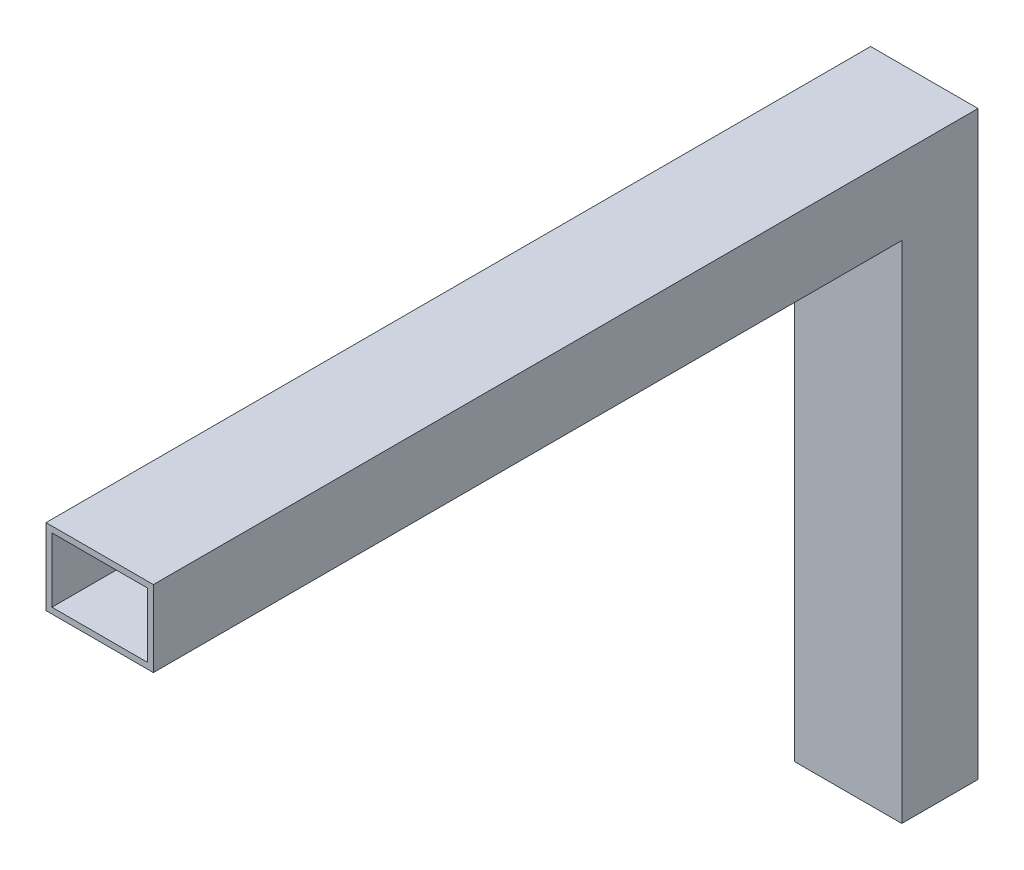
ISO-10303-21;
HEADER;
FILE_DESCRIPTION(('STEP AP214'),'2;1');
FILE_NAME('part.step','',(''),(''),'','','');
FILE_SCHEMA(('AUTOMOTIVE_DESIGN { 1 0 10303 214 1 1 1 1 }'));
ENDSEC;
DATA;
#1=APPLICATION_CONTEXT('core data for automotive mechanical design processes');
#2=APPLICATION_PROTOCOL_DEFINITION('international standard','automotive_design',2000,#1);
#3=PRODUCT_CONTEXT('',#1,'mechanical');
#4=PRODUCT('Part','Part','',(#3));
#5=PRODUCT_RELATED_PRODUCT_CATEGORY('part','',(#4));
#6=PRODUCT_DEFINITION_FORMATION('','',#4);
#7=PRODUCT_DEFINITION_CONTEXT('part definition',#1,'design');
#8=PRODUCT_DEFINITION('design','',#6,#7);
#9=PRODUCT_DEFINITION_SHAPE('','',#8);
#10=(LENGTH_UNIT() NAMED_UNIT(*) SI_UNIT(.MILLI.,.METRE.));
#11=(NAMED_UNIT(*) PLANE_ANGLE_UNIT() SI_UNIT($,.RADIAN.));
#12=(NAMED_UNIT(*) SI_UNIT($,.STERADIAN.) SOLID_ANGLE_UNIT());
#13=UNCERTAINTY_MEASURE_WITH_UNIT(LENGTH_MEASURE(1.E-05),#10,'distance_accuracy_value','');
#14=(GEOMETRIC_REPRESENTATION_CONTEXT(3) GLOBAL_UNCERTAINTY_ASSIGNED_CONTEXT((#13)) GLOBAL_UNIT_ASSIGNED_CONTEXT((#10,
#11,#12)) REPRESENTATION_CONTEXT('',''));
#15=CARTESIAN_POINT('',(0.,0.,0.));
#16=DIRECTION('',(0.,0.,1.));
#17=DIRECTION('',(1.,0.,0.));
#18=AXIS2_PLACEMENT_3D('',#15,#16,#17);
#19=CARTESIAN_POINT('',(0.,-24.8230901340624,14.5610305255673));
#20=DIRECTION('',(0.,1.,0.));
#21=DIRECTION('',(1.,0.,0.));
#22=AXIS2_PLACEMENT_3D('',#19,#20,#21);
#23=PLANE('',#22);
#24=DIRECTION('',(0.,0.,1.));
#25=VECTOR('',#24,1.);
#26=CARTESIAN_POINT('',(4.52520100822085,-24.8230901340624,-9.59201427052958));
#27=LINE('',#26,#25);
#28=CARTESIAN_POINT('',(4.52520100822085,-24.8230901340624,-9.59201427052958));
#29=VERTEX_POINT('',#28);
#30=CARTESIAN_POINT('',(4.52520100822085,-24.8230901340624,-3.16622199949135));
#31=VERTEX_POINT('',#30);
#32=EDGE_CURVE('E208',#29,#31,#27,.T.);
#33=ORIENTED_EDGE('',*,*,#32,.T.);
#34=DIRECTION('',(-1.,0.,0.));
#35=VECTOR('',#34,1.);
#36=CARTESIAN_POINT('',(-4.52520100822085,-24.8230901340624,-3.16622199949135));
#37=LINE('',#36,#35);
#38=CARTESIAN_POINT('',(-4.52520100822085,-24.8230901340624,-3.16622199949135));
#39=VERTEX_POINT('',#38);
#40=EDGE_CURVE('E206',#31,#39,#37,.T.);
#41=ORIENTED_EDGE('',*,*,#40,.T.);
#42=DIRECTION('',(0.,0.,-1.));
#43=VECTOR('',#42,1.);
#44=CARTESIAN_POINT('',(-4.52520100822085,-24.8230901340624,-9.59201427052958));
#45=LINE('',#44,#43);
#46=CARTESIAN_POINT('',(-4.52520100822085,-24.8230901340624,-9.59201427052958));
#47=VERTEX_POINT('',#46);
#48=EDGE_CURVE('E204',#39,#47,#45,.T.);
#49=ORIENTED_EDGE('',*,*,#48,.T.);
#50=DIRECTION('',(1.,0.,0.));
#51=VECTOR('',#50,1.);
#52=CARTESIAN_POINT('',(-4.52520100822085,-24.8230901340624,-9.59201427052958));
#53=LINE('',#52,#51);
#54=EDGE_CURVE('E147',#47,#29,#53,.T.);
#55=ORIENTED_EDGE('',*,*,#54,.T.);
#56=EDGE_LOOP('',(#33,#41,#49,#55));
#57=FACE_BOUND('',#56,.T.);
#58=DIRECTION('',(0.,0.,1.));
#59=VECTOR('',#58,1.);
#60=CARTESIAN_POINT('',(4.02520100822085,-24.8230901340624,-9.59201427052958));
#61=LINE('',#60,#59);
#62=CARTESIAN_POINT('',(4.02520100822085,-24.8230901340624,-9.09201427052958));
#63=VERTEX_POINT('',#62);
#64=CARTESIAN_POINT('',(4.02520100822085,-24.8230901340624,-3.66622199949135));
#65=VERTEX_POINT('',#64);
#66=EDGE_CURVE('E137',#63,#65,#61,.T.);
#67=ORIENTED_EDGE('',*,*,#66,.F.);
#68=DIRECTION('',(1.,0.,0.));
#69=VECTOR('',#68,1.);
#70=CARTESIAN_POINT('',(-4.52520100822085,-24.8230901340624,-9.09201427052958));
#71=LINE('',#70,#69);
#72=CARTESIAN_POINT('',(-4.02520100822085,-24.8230901340624,-9.09201427052958));
#73=VERTEX_POINT('',#72);
#74=EDGE_CURVE('E167',#73,#63,#71,.T.);
#75=ORIENTED_EDGE('',*,*,#74,.F.);
#76=DIRECTION('',(0.,0.,-1.));
#77=VECTOR('',#76,1.);
#78=CARTESIAN_POINT('',(-4.02520100822085,-24.8230901340624,-9.59201427052958));
#79=LINE('',#78,#77);
#80=CARTESIAN_POINT('',(-4.02520100822085,-24.8230901340624,-3.66622199949135));
#81=VERTEX_POINT('',#80);
#82=EDGE_CURVE('E165',#81,#73,#79,.T.);
#83=ORIENTED_EDGE('',*,*,#82,.F.);
#84=DIRECTION('',(-1.,0.,0.));
#85=VECTOR('',#84,1.);
#86=CARTESIAN_POINT('',(-4.52520100822085,-24.8230901340624,-3.66622199949135));
#87=LINE('',#86,#85);
#88=EDGE_CURVE('E163',#65,#81,#87,.T.);
#89=ORIENTED_EDGE('',*,*,#88,.F.);
#90=EDGE_LOOP('',(#67,#75,#83,#89));
#91=FACE_BOUND('',#90,.T.);
#92=ADVANCED_FACE('F39',(#57,#91),#23,.F.);
#93=CARTESIAN_POINT('',(0.,0.,59.90823987662));
#94=DIRECTION('',(0.,0.,1.));
#95=DIRECTION('',(1.,0.,0.));
#96=AXIS2_PLACEMENT_3D('',#93,#94,#95);
#97=PLANE('',#96);
#98=DIRECTION('',(0.,-1.,0.));
#99=VECTOR('',#98,1.);
#100=CARTESIAN_POINT('',(4.52520100822085,24.1530447960969,59.90823987662));
#101=LINE('',#100,#99);
#102=CARTESIAN_POINT('',(4.52520100822085,24.1530447960969,59.90823987662));
#103=VERTEX_POINT('',#102);
#104=CARTESIAN_POINT('',(4.52520100822085,17.7272525250587,59.90823987662));
#105=VERTEX_POINT('',#104);
#106=EDGE_CURVE('E180',#103,#105,#101,.T.);
#107=ORIENTED_EDGE('',*,*,#106,.F.);
#108=DIRECTION('',(1.,0.,0.));
#109=VECTOR('',#108,1.);
#110=CARTESIAN_POINT('',(-4.52520100822085,24.1530447960969,59.90823987662));
#111=LINE('',#110,#109);
#112=CARTESIAN_POINT('',(-4.52520100822085,24.1530447960969,59.90823987662));
#113=VERTEX_POINT('',#112);
#114=EDGE_CURVE('E191',#113,#103,#111,.T.);
#115=ORIENTED_EDGE('',*,*,#114,.F.);
#116=DIRECTION('',(0.,1.,0.));
#117=VECTOR('',#116,1.);
#118=CARTESIAN_POINT('',(-4.52520100822085,24.1530447960969,59.90823987662));
#119=LINE('',#118,#117);
#120=CARTESIAN_POINT('',(-4.52520100822085,17.7272525250587,59.90823987662));
#121=VERTEX_POINT('',#120);
#122=EDGE_CURVE('E194',#121,#113,#119,.T.);
#123=ORIENTED_EDGE('',*,*,#122,.F.);
#124=DIRECTION('',(-1.,0.,0.));
#125=VECTOR('',#124,1.);
#126=CARTESIAN_POINT('',(-4.52520100822085,17.7272525250587,59.90823987662));
#127=LINE('',#126,#125);
#128=EDGE_CURVE('E183',#105,#121,#127,.T.);
#129=ORIENTED_EDGE('',*,*,#128,.F.);
#130=EDGE_LOOP('',(#107,#115,#123,#129));
#131=FACE_BOUND('',#130,.T.);
#132=DIRECTION('',(1.,0.,0.));
#133=VECTOR('',#132,1.);
#134=CARTESIAN_POINT('',(-4.52520100822085,23.6530447960969,59.90823987662));
#135=LINE('',#134,#133);
#136=CARTESIAN_POINT('',(-4.02520100822085,23.6530447960969,59.90823987662));
#137=VERTEX_POINT('',#136);
#138=CARTESIAN_POINT('',(4.02520100822085,23.6530447960969,59.90823987662));
#139=VERTEX_POINT('',#138);
#140=EDGE_CURVE('E158',#137,#139,#135,.T.);
#141=ORIENTED_EDGE('',*,*,#140,.T.);
#142=DIRECTION('',(0.,-1.,0.));
#143=VECTOR('',#142,1.);
#144=CARTESIAN_POINT('',(4.02520100822085,24.1530447960969,59.90823987662));
#145=LINE('',#144,#143);
#146=CARTESIAN_POINT('',(4.02520100822085,18.2272525250587,59.90823987662));
#147=VERTEX_POINT('',#146);
#148=EDGE_CURVE('E175',#139,#147,#145,.T.);
#149=ORIENTED_EDGE('',*,*,#148,.T.);
#150=DIRECTION('',(-1.,0.,0.));
#151=VECTOR('',#150,1.);
#152=CARTESIAN_POINT('',(-4.52520100822085,18.2272525250587,59.90823987662));
#153=LINE('',#152,#151);
#154=CARTESIAN_POINT('',(-4.02520100822085,18.2272525250587,59.90823987662));
#155=VERTEX_POINT('',#154);
#156=EDGE_CURVE('E152',#147,#155,#153,.T.);
#157=ORIENTED_EDGE('',*,*,#156,.T.);
#158=DIRECTION('',(0.,1.,0.));
#159=VECTOR('',#158,1.);
#160=CARTESIAN_POINT('',(-4.02520100822085,24.1530447960969,59.90823987662));
#161=LINE('',#160,#159);
#162=EDGE_CURVE('E171',#155,#137,#161,.T.);
#163=ORIENTED_EDGE('',*,*,#162,.T.);
#164=EDGE_LOOP('',(#141,#149,#157,#163));
#165=FACE_BOUND('',#164,.T.);
#166=ADVANCED_FACE('F230',(#131,#165),#97,.T.);
#167=CARTESIAN_POINT('',(-4.52520100822085,24.5743344096488,-3.16622199949135));
#168=DIRECTION('',(0.,0.,1.));
#169=DIRECTION('',(1.,0.,0.));
#170=AXIS2_PLACEMENT_3D('',#167,#168,#169);
#171=PLANE('',#170);
#172=DIRECTION('',(1.,0.,0.));
#173=VECTOR('',#172,1.);
#174=CARTESIAN_POINT('',(-4.52520100822085,17.7272525250587,-3.16622199949135));
#175=LINE('',#174,#173);
#176=CARTESIAN_POINT('',(-4.52520100822085,17.7272525250587,-3.16622199949135));
#177=VERTEX_POINT('',#176);
#178=CARTESIAN_POINT('',(4.52520100822085,17.7272525250587,-3.16622199949134));
#179=VERTEX_POINT('',#178);
#180=EDGE_CURVE('E11',#177,#179,#175,.T.);
#181=ORIENTED_EDGE('',*,*,#180,.F.);
#182=DIRECTION('',(0.,-1.,0.));
#183=VECTOR('',#182,1.);
#184=CARTESIAN_POINT('',(-4.52520100822085,24.5743344096488,-3.16622199949135));
#185=LINE('',#184,#183);
#186=EDGE_CURVE('E213',#177,#39,#185,.T.);
#187=ORIENTED_EDGE('',*,*,#186,.T.);
#188=ORIENTED_EDGE('',*,*,#40,.F.);
#189=DIRECTION('',(0.,-1.,0.));
#190=VECTOR('',#189,1.);
#191=CARTESIAN_POINT('',(4.52520100822085,24.5743344096488,-3.16622199949135));
#192=LINE('',#191,#190);
#193=EDGE_CURVE('E215',#179,#31,#192,.T.);
#194=ORIENTED_EDGE('',*,*,#193,.F.);
#195=EDGE_LOOP('',(#181,#187,#188,#194));
#196=FACE_BOUND('',#195,.T.);
#197=ADVANCED_FACE('F241',(#196),#171,.T.);
#198=CARTESIAN_POINT('',(-4.52520100822085,24.5743344096488,-9.59201427052958));
#199=DIRECTION('',(0.,0.,-1.));
#200=DIRECTION('',(-1.,0.,0.));
#201=AXIS2_PLACEMENT_3D('',#198,#199,#200);
#202=PLANE('',#201);
#203=DIRECTION('',(-1.,0.,0.));
#204=VECTOR('',#203,1.);
#205=CARTESIAN_POINT('',(-4.52520100822085,24.1530447960969,-9.59201427052958));
#206=LINE('',#205,#204);
#207=CARTESIAN_POINT('',(4.52520100822085,24.1530447960969,-9.59201427052958));
#208=VERTEX_POINT('',#207);
#209=CARTESIAN_POINT('',(-4.52520100822085,24.1530447960969,-9.59201427052958));
#210=VERTEX_POINT('',#209);
#211=EDGE_CURVE('E47',#208,#210,#206,.T.);
#212=ORIENTED_EDGE('',*,*,#211,.F.);
#213=DIRECTION('',(0.,-1.,0.));
#214=VECTOR('',#213,1.);
#215=CARTESIAN_POINT('',(4.52520100822085,24.5743344096488,-9.59201427052958));
#216=LINE('',#215,#214);
#217=EDGE_CURVE('E42',#208,#29,#216,.T.);
#218=ORIENTED_EDGE('',*,*,#217,.T.);
#219=ORIENTED_EDGE('',*,*,#54,.F.);
#220=DIRECTION('',(0.,-1.,0.));
#221=VECTOR('',#220,1.);
#222=CARTESIAN_POINT('',(-4.52520100822085,24.5743344096488,-9.59201427052958));
#223=LINE('',#222,#221);
#224=EDGE_CURVE('E210',#210,#47,#223,.T.);
#225=ORIENTED_EDGE('',*,*,#224,.F.);
#226=EDGE_LOOP('',(#212,#218,#219,#225));
#227=FACE_BOUND('',#226,.T.);
#228=ADVANCED_FACE('F223',(#227),#202,.T.);
#229=CARTESIAN_POINT('',(-4.52520100822085,24.1530447960969,59.90823987662));
#230=DIRECTION('',(0.,1.,0.));
#231=DIRECTION('',(0.,0.,1.));
#232=AXIS2_PLACEMENT_3D('',#229,#230,#231);
#233=PLANE('',#232);
#234=DIRECTION('',(0.,0.,-1.));
#235=VECTOR('',#234,1.);
#236=CARTESIAN_POINT('',(4.52520100822085,24.1530447960969,59.90823987662));
#237=LINE('',#236,#235);
#238=EDGE_CURVE('E188',#103,#208,#237,.T.);
#239=ORIENTED_EDGE('',*,*,#238,.T.);
#240=ORIENTED_EDGE('',*,*,#211,.T.);
#241=DIRECTION('',(0.,0.,-1.));
#242=VECTOR('',#241,1.);
#243=CARTESIAN_POINT('',(-4.52520100822085,24.1530447960969,59.90823987662));
#244=LINE('',#243,#242);
#245=EDGE_CURVE('E179',#113,#210,#244,.T.);
#246=ORIENTED_EDGE('',*,*,#245,.F.);
#247=ORIENTED_EDGE('',*,*,#114,.T.);
#248=EDGE_LOOP('',(#239,#240,#246,#247));
#249=FACE_BOUND('',#248,.T.);
#250=ADVANCED_FACE('F227',(#249),#233,.T.);
#251=CARTESIAN_POINT('',(-4.52520100822085,24.1530447960969,59.90823987662));
#252=DIRECTION('',(-1.,0.,0.));
#253=DIRECTION('',(0.,0.,1.));
#254=AXIS2_PLACEMENT_3D('',#251,#252,#253);
#255=PLANE('',#254);
#256=ORIENTED_EDGE('',*,*,#245,.T.);
#257=ORIENTED_EDGE('',*,*,#224,.T.);
#258=ORIENTED_EDGE('',*,*,#48,.F.);
#259=ORIENTED_EDGE('',*,*,#186,.F.);
#260=DIRECTION('',(0.,0.,-1.));
#261=VECTOR('',#260,1.);
#262=CARTESIAN_POINT('',(-4.52520100822085,17.7272525250587,59.90823987662));
#263=LINE('',#262,#261);
#264=EDGE_CURVE('E187',#121,#177,#263,.T.);
#265=ORIENTED_EDGE('',*,*,#264,.F.);
#266=ORIENTED_EDGE('',*,*,#122,.T.);
#267=EDGE_LOOP('',(#256,#257,#258,#259,#265,#266));
#268=FACE_BOUND('',#267,.T.);
#269=ADVANCED_FACE('F234',(#268),#255,.T.);
#270=CARTESIAN_POINT('',(-4.52520100822085,17.7272525250587,59.90823987662));
#271=DIRECTION('',(0.,-1.,0.));
#272=DIRECTION('',(0.,0.,-1.));
#273=AXIS2_PLACEMENT_3D('',#270,#271,#272);
#274=PLANE('',#273);
#275=ORIENTED_EDGE('',*,*,#264,.T.);
#276=ORIENTED_EDGE('',*,*,#180,.T.);
#277=DIRECTION('',(0.,0.,-1.));
#278=VECTOR('',#277,1.);
#279=CARTESIAN_POINT('',(4.52520100822085,17.7272525250587,59.90823987662));
#280=LINE('',#279,#278);
#281=EDGE_CURVE('E184',#105,#179,#280,.T.);
#282=ORIENTED_EDGE('',*,*,#281,.F.);
#283=ORIENTED_EDGE('',*,*,#128,.T.);
#284=EDGE_LOOP('',(#275,#276,#282,#283));
#285=FACE_BOUND('',#284,.T.);
#286=ADVANCED_FACE('F238',(#285),#274,.T.);
#287=CARTESIAN_POINT('',(4.52520100822085,24.1530447960969,59.90823987662));
#288=DIRECTION('',(1.,0.,0.));
#289=DIRECTION('',(0.,0.,-1.));
#290=AXIS2_PLACEMENT_3D('',#287,#288,#289);
#291=PLANE('',#290);
#292=ORIENTED_EDGE('',*,*,#281,.T.);
#293=ORIENTED_EDGE('',*,*,#193,.T.);
#294=ORIENTED_EDGE('',*,*,#32,.F.);
#295=ORIENTED_EDGE('',*,*,#217,.F.);
#296=ORIENTED_EDGE('',*,*,#238,.F.);
#297=ORIENTED_EDGE('',*,*,#106,.T.);
#298=EDGE_LOOP('',(#292,#293,#294,#295,#296,#297));
#299=FACE_BOUND('',#298,.T.);
#300=ADVANCED_FACE('F225',(#299),#291,.T.);
#301=CARTESIAN_POINT('',(4.02520100822085,24.5743344096488,-9.59201427052958));
#302=DIRECTION('',(1.,0.,0.));
#303=DIRECTION('',(0.,0.,-1.));
#304=AXIS2_PLACEMENT_3D('',#301,#302,#303);
#305=PLANE('',#304);
#306=DIRECTION('',(0.,-1.,0.));
#307=VECTOR('',#306,1.);
#308=CARTESIAN_POINT('',(4.02520100822085,24.5743344096488,-3.66622199949135));
#309=LINE('',#308,#307);
#310=CARTESIAN_POINT('',(4.02520100822085,18.2272525250587,-3.66622199949135));
#311=VERTEX_POINT('',#310);
#312=EDGE_CURVE('E129',#311,#65,#309,.T.);
#313=ORIENTED_EDGE('',*,*,#312,.F.);
#314=DIRECTION('',(0.,0.,-1.));
#315=VECTOR('',#314,1.);
#316=CARTESIAN_POINT('',(4.02520100822085,18.2272525250587,59.90823987662));
#317=LINE('',#316,#315);
#318=EDGE_CURVE('E133',#147,#311,#317,.T.);
#319=ORIENTED_EDGE('',*,*,#318,.F.);
#320=ORIENTED_EDGE('',*,*,#148,.F.);
#321=DIRECTION('',(0.,0.,-1.));
#322=VECTOR('',#321,1.);
#323=CARTESIAN_POINT('',(4.02520100822085,23.6530447960969,59.90823987662));
#324=LINE('',#323,#322);
#325=CARTESIAN_POINT('',(4.02520100822085,23.6530447960969,-9.09201427052958));
#326=VERTEX_POINT('',#325);
#327=EDGE_CURVE('E153',#139,#326,#324,.T.);
#328=ORIENTED_EDGE('',*,*,#327,.T.);
#329=DIRECTION('',(0.,-1.,0.));
#330=VECTOR('',#329,1.);
#331=CARTESIAN_POINT('',(4.02520100822085,24.5743344096488,-9.09201427052958));
#332=LINE('',#331,#330);
#333=EDGE_CURVE('E140',#326,#63,#332,.T.);
#334=ORIENTED_EDGE('',*,*,#333,.T.);
#335=ORIENTED_EDGE('',*,*,#66,.T.);
#336=EDGE_LOOP('',(#313,#319,#320,#328,#334,#335));
#337=FACE_BOUND('',#336,.T.);
#338=ADVANCED_FACE('F131',(#337),#305,.F.);
#339=CARTESIAN_POINT('',(-4.52520100822085,24.5743344096488,-3.66622199949135));
#340=DIRECTION('',(0.,0.,1.));
#341=DIRECTION('',(1.,0.,0.));
#342=AXIS2_PLACEMENT_3D('',#339,#340,#341);
#343=PLANE('',#342);
#344=DIRECTION('',(1.,0.,0.));
#345=VECTOR('',#344,1.);
#346=CARTESIAN_POINT('',(-4.52520100822085,18.2272525250587,-3.66622199949135));
#347=LINE('',#346,#345);
#348=CARTESIAN_POINT('',(-4.02520100822085,18.2272525250587,-3.66622199949135));
#349=VERTEX_POINT('',#348);
#350=EDGE_CURVE('E144',#349,#311,#347,.T.);
#351=ORIENTED_EDGE('',*,*,#350,.T.);
#352=ORIENTED_EDGE('',*,*,#312,.T.);
#353=ORIENTED_EDGE('',*,*,#88,.T.);
#354=DIRECTION('',(0.,-1.,0.));
#355=VECTOR('',#354,1.);
#356=CARTESIAN_POINT('',(-4.02520100822085,24.5743344096488,-3.66622199949135));
#357=LINE('',#356,#355);
#358=EDGE_CURVE('E141',#349,#81,#357,.T.);
#359=ORIENTED_EDGE('',*,*,#358,.F.);
#360=EDGE_LOOP('',(#351,#352,#353,#359));
#361=FACE_BOUND('',#360,.T.);
#362=ADVANCED_FACE('F145',(#361),#343,.F.);
#363=CARTESIAN_POINT('',(-4.02520100822085,24.5743344096488,-9.59201427052958));
#364=DIRECTION('',(-1.,0.,0.));
#365=DIRECTION('',(0.,0.,1.));
#366=AXIS2_PLACEMENT_3D('',#363,#364,#365);
#367=PLANE('',#366);
#368=DIRECTION('',(0.,-1.,0.));
#369=VECTOR('',#368,1.);
#370=CARTESIAN_POINT('',(-4.02520100822085,24.5743344096488,-9.09201427052958));
#371=LINE('',#370,#369);
#372=CARTESIAN_POINT('',(-4.02520100822085,23.6530447960969,-9.09201427052958));
#373=VERTEX_POINT('',#372);
#374=EDGE_CURVE('E55',#373,#73,#371,.T.);
#375=ORIENTED_EDGE('',*,*,#374,.F.);
#376=DIRECTION('',(0.,0.,-1.));
#377=VECTOR('',#376,1.);
#378=CARTESIAN_POINT('',(-4.02520100822085,23.6530447960969,59.90823987662));
#379=LINE('',#378,#377);
#380=EDGE_CURVE('E155',#137,#373,#379,.T.);
#381=ORIENTED_EDGE('',*,*,#380,.F.);
#382=ORIENTED_EDGE('',*,*,#162,.F.);
#383=DIRECTION('',(0.,0.,-1.));
#384=VECTOR('',#383,1.);
#385=CARTESIAN_POINT('',(-4.02520100822085,18.2272525250587,59.90823987662));
#386=LINE('',#385,#384);
#387=EDGE_CURVE('E63',#155,#349,#386,.T.);
#388=ORIENTED_EDGE('',*,*,#387,.T.);
#389=ORIENTED_EDGE('',*,*,#358,.T.);
#390=ORIENTED_EDGE('',*,*,#82,.T.);
#391=EDGE_LOOP('',(#375,#381,#382,#388,#389,#390));
#392=FACE_BOUND('',#391,.T.);
#393=ADVANCED_FACE('F249',(#392),#367,.F.);
#394=CARTESIAN_POINT('',(-4.52520100822085,24.5743344096488,-9.09201427052958));
#395=DIRECTION('',(0.,0.,-1.));
#396=DIRECTION('',(-1.,0.,0.));
#397=AXIS2_PLACEMENT_3D('',#394,#395,#396);
#398=PLANE('',#397);
#399=DIRECTION('',(-1.,0.,0.));
#400=VECTOR('',#399,1.);
#401=CARTESIAN_POINT('',(-4.52520100822085,23.6530447960969,-9.09201427052958));
#402=LINE('',#401,#400);
#403=EDGE_CURVE('E148',#326,#373,#402,.T.);
#404=ORIENTED_EDGE('',*,*,#403,.T.);
#405=ORIENTED_EDGE('',*,*,#374,.T.);
#406=ORIENTED_EDGE('',*,*,#74,.T.);
#407=ORIENTED_EDGE('',*,*,#333,.F.);
#408=EDGE_LOOP('',(#404,#405,#406,#407));
#409=FACE_BOUND('',#408,.T.);
#410=ADVANCED_FACE('F260',(#409),#398,.F.);
#411=CARTESIAN_POINT('',(-4.52520100822085,23.6530447960969,59.90823987662));
#412=DIRECTION('',(0.,1.,0.));
#413=DIRECTION('',(0.,0.,1.));
#414=AXIS2_PLACEMENT_3D('',#411,#412,#413);
#415=PLANE('',#414);
#416=ORIENTED_EDGE('',*,*,#327,.F.);
#417=ORIENTED_EDGE('',*,*,#140,.F.);
#418=ORIENTED_EDGE('',*,*,#380,.T.);
#419=ORIENTED_EDGE('',*,*,#403,.F.);
#420=EDGE_LOOP('',(#416,#417,#418,#419));
#421=FACE_BOUND('',#420,.T.);
#422=ADVANCED_FACE('F258',(#421),#415,.F.);
#423=CARTESIAN_POINT('',(-4.52520100822085,18.2272525250587,59.90823987662));
#424=DIRECTION('',(0.,-1.,0.));
#425=DIRECTION('',(0.,0.,-1.));
#426=AXIS2_PLACEMENT_3D('',#423,#424,#425);
#427=PLANE('',#426);
#428=ORIENTED_EDGE('',*,*,#387,.F.);
#429=ORIENTED_EDGE('',*,*,#156,.F.);
#430=ORIENTED_EDGE('',*,*,#318,.T.);
#431=ORIENTED_EDGE('',*,*,#350,.F.);
#432=EDGE_LOOP('',(#428,#429,#430,#431));
#433=FACE_BOUND('',#432,.T.);
#434=ADVANCED_FACE('F150',(#433),#427,.F.);
#435=CLOSED_SHELL('',(#92,#166,#197,#228,#250,#269,#286,#300,#338,#362,#393,#410,#422,#434));
#436=MANIFOLD_SOLID_BREP('B2',#435);
#437=ADVANCED_BREP_SHAPE_REPRESENTATION('',(#18,#436),#14);
#438=SHAPE_DEFINITION_REPRESENTATION(#9,#437);
ENDSEC;
END-ISO-10303-21;
